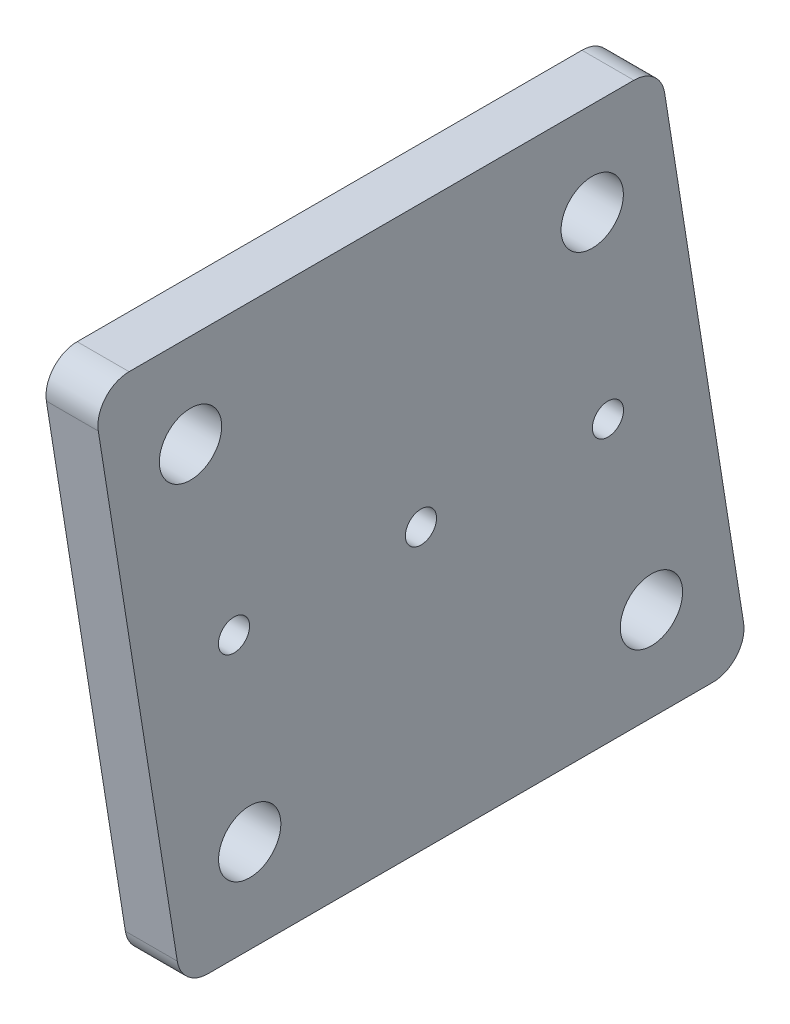
ISO-10303-21;
HEADER;
FILE_DESCRIPTION(('STEP AP214'),'2;1');
FILE_NAME('part.step','',(''),(''),'','','');
FILE_SCHEMA(('AUTOMOTIVE_DESIGN { 1 0 10303 214 1 1 1 1 }'));
ENDSEC;
DATA;
#1=APPLICATION_CONTEXT('core data for automotive mechanical design processes');
#2=APPLICATION_PROTOCOL_DEFINITION('international standard','automotive_design',2000,#1);
#3=PRODUCT_CONTEXT('',#1,'mechanical');
#4=PRODUCT('Part','Part','',(#3));
#5=PRODUCT_RELATED_PRODUCT_CATEGORY('part','',(#4));
#6=PRODUCT_DEFINITION_FORMATION('','',#4);
#7=PRODUCT_DEFINITION_CONTEXT('part definition',#1,'design');
#8=PRODUCT_DEFINITION('design','',#6,#7);
#9=PRODUCT_DEFINITION_SHAPE('','',#8);
#10=(LENGTH_UNIT() NAMED_UNIT(*) SI_UNIT(.MILLI.,.METRE.));
#11=(NAMED_UNIT(*) PLANE_ANGLE_UNIT() SI_UNIT($,.RADIAN.));
#12=(NAMED_UNIT(*) SI_UNIT($,.STERADIAN.) SOLID_ANGLE_UNIT());
#13=UNCERTAINTY_MEASURE_WITH_UNIT(LENGTH_MEASURE(1.E-05),#10,'distance_accuracy_value','');
#14=(GEOMETRIC_REPRESENTATION_CONTEXT(3) GLOBAL_UNCERTAINTY_ASSIGNED_CONTEXT((#13)) GLOBAL_UNIT_ASSIGNED_CONTEXT((#10,
#11,#12)) REPRESENTATION_CONTEXT('',''));
#15=CARTESIAN_POINT('',(0.,0.,0.));
#16=DIRECTION('',(0.,0.,1.));
#17=DIRECTION('',(1.,0.,0.));
#18=AXIS2_PLACEMENT_3D('',#15,#16,#17);
#19=CARTESIAN_POINT('',(5.,0.,0.));
#20=DIRECTION('',(1.,0.,0.));
#21=DIRECTION('',(0.,0.,-1.));
#22=AXIS2_PLACEMENT_3D('',#19,#20,#21);
#23=PLANE('',#22);
#24=CARTESIAN_POINT('',(5.,18.,1.51283602329086));
#25=DIRECTION('',(1.,0.,0.));
#26=DIRECTION('',(0.,0.,-1.));
#27=AXIS2_PLACEMENT_3D('',#24,#25,#26);
#28=CIRCLE('',#27,1.5);
#29=CARTESIAN_POINT('',(5.,18.,0.0128360232908549));
#30=VERTEX_POINT('',#29);
#31=EDGE_CURVE('E205',#30,#30,#28,.T.);
#32=ORIENTED_EDGE('',*,*,#31,.F.);
#33=EDGE_LOOP('',(#32));
#34=FACE_BOUND('',#33,.T.);
#35=CARTESIAN_POINT('',(5.,36.,-32.9743279534183));
#36=DIRECTION('',(1.,0.,0.));
#37=DIRECTION('',(0.,0.,-1.));
#38=AXIS2_PLACEMENT_3D('',#35,#36,#37);
#39=CIRCLE('',#38,2.99999999999999);
#40=CARTESIAN_POINT('',(5.,36.,-35.9743279534183));
#41=VERTEX_POINT('',#40);
#42=EDGE_CURVE('E193',#41,#41,#39,.T.);
#43=ORIENTED_EDGE('',*,*,#42,.F.);
#44=EDGE_LOOP('',(#43));
#45=FACE_BOUND('',#44,.T.);
#46=CARTESIAN_POINT('',(5.,0.,-38.6761678051017));
#47=DIRECTION('',(1.,0.,0.));
#48=DIRECTION('',(0.,0.,-1.));
#49=AXIS2_PLACEMENT_3D('',#46,#47,#48);
#50=CIRCLE('',#49,3.);
#51=CARTESIAN_POINT('',(5.,0.,-41.6761678051017));
#52=VERTEX_POINT('',#51);
#53=EDGE_CURVE('E182',#52,#52,#50,.T.);
#54=ORIENTED_EDGE('',*,*,#53,.F.);
#55=EDGE_LOOP('',(#54));
#56=FACE_BOUND('',#55,.T.);
#57=DIRECTION('',(0.,0.987688340595137,0.156434465040235));
#58=VECTOR('',#57,1.);
#59=CARTESIAN_POINT('',(5.,-8.99999999999999,-48.1001022617478));
#60=LINE('',#59,#58);
#61=CARTESIAN_POINT('',(5.,-5.53069660487929,-47.5506185851956));
#62=VERTEX_POINT('',#61);
#63=CARTESIAN_POINT('',(5.,42.4693033951207,-39.9481654496177));
#64=VERTEX_POINT('',#63);
#65=EDGE_CURVE('E177',#62,#64,#60,.T.);
#66=ORIENTED_EDGE('',*,*,#65,.T.);
#67=CARTESIAN_POINT('',(5.,42.,-36.9851004278322));
#68=DIRECTION('',(1.,0.,0.));
#69=DIRECTION('',(0.,0.,-1.));
#70=AXIS2_PLACEMENT_3D('',#67,#68,#69);
#71=CIRCLE('',#70,3.);
#72=CARTESIAN_POINT('',(5.,45.,-36.9851004278322));
#73=VERTEX_POINT('',#72);
#74=EDGE_CURVE('E154',#64,#73,#71,.T.);
#75=ORIENTED_EDGE('',*,*,#74,.T.);
#76=DIRECTION('',(0.,0.,1.));
#77=VECTOR('',#76,1.);
#78=CARTESIAN_POINT('',(5.,45.,-39.5473424842226));
#79=LINE('',#78,#77);
#80=CARTESIAN_POINT('',(5.,45.,11.6132256099919));
#81=VERTEX_POINT('',#80);
#82=EDGE_CURVE('E125',#73,#81,#79,.T.);
#83=ORIENTED_EDGE('',*,*,#82,.T.);
#84=CARTESIAN_POINT('',(5.,42.,11.6132256099919));
#85=DIRECTION('',(1.,0.,0.));
#86=DIRECTION('',(0.,0.,-1.));
#87=AXIS2_PLACEMENT_3D('',#84,#85,#86);
#88=CIRCLE('',#87,3.);
#89=CARTESIAN_POINT('',(5.,41.5306966048793,14.5762906317773));
#90=VERTEX_POINT('',#89);
#91=EDGE_CURVE('E149',#81,#90,#88,.T.);
#92=ORIENTED_EDGE('',*,*,#91,.T.);
#93=DIRECTION('',(0.,-0.987688340595137,-0.156434465040235));
#94=VECTOR('',#93,1.);
#95=CARTESIAN_POINT('',(5.,45.,15.1257743083295));
#96=LINE('',#95,#94);
#97=CARTESIAN_POINT('',(5.,-6.46930339512072,6.97383749619938));
#98=VERTEX_POINT('',#97);
#99=EDGE_CURVE('E132',#90,#98,#96,.T.);
#100=ORIENTED_EDGE('',*,*,#99,.T.);
#101=CARTESIAN_POINT('',(5.,-6.,4.01077247441397));
#102=DIRECTION('',(1.,0.,0.));
#103=DIRECTION('',(0.,0.,-1.));
#104=AXIS2_PLACEMENT_3D('',#101,#102,#103);
#105=CIRCLE('',#104,3.);
#106=CARTESIAN_POINT('',(5.,-9.,4.01077247441397));
#107=VERTEX_POINT('',#106);
#108=EDGE_CURVE('E61',#98,#107,#105,.T.);
#109=ORIENTED_EDGE('',*,*,#108,.T.);
#110=DIRECTION('',(0.,0.,-1.));
#111=VECTOR('',#110,1.);
#112=CARTESIAN_POINT('',(5.,-9.,6.57301453080436));
#113=LINE('',#112,#111);
#114=CARTESIAN_POINT('',(5.,-8.99999999999999,-44.5875535634102));
#115=VERTEX_POINT('',#114);
#116=EDGE_CURVE('E135',#107,#115,#113,.T.);
#117=ORIENTED_EDGE('',*,*,#116,.T.);
#118=CARTESIAN_POINT('',(5.,-5.99999999999999,-44.5875535634102));
#119=DIRECTION('',(1.,0.,0.));
#120=DIRECTION('',(0.,0.,-1.));
#121=AXIS2_PLACEMENT_3D('',#118,#119,#120);
#122=CIRCLE('',#121,3.);
#123=EDGE_CURVE('E152',#115,#62,#122,.T.);
#124=ORIENTED_EDGE('',*,*,#123,.T.);
#125=EDGE_LOOP('',(#66,#75,#83,#92,#100,#109,#117,#124));
#126=FACE_BOUND('',#125,.T.);
#127=CARTESIAN_POINT('',(5.,0.,0.));
#128=DIRECTION('',(1.,0.,0.));
#129=DIRECTION('',(0.,0.,-1.));
#130=AXIS2_PLACEMENT_3D('',#127,#128,#129);
#131=CIRCLE('',#130,3.);
#132=CARTESIAN_POINT('',(5.,0.,-3.));
#133=VERTEX_POINT('',#132);
#134=EDGE_CURVE('E170',#133,#133,#131,.T.);
#135=ORIENTED_EDGE('',*,*,#134,.F.);
#136=EDGE_LOOP('',(#135));
#137=FACE_BOUND('',#136,.T.);
#138=CARTESIAN_POINT('',(5.,36.,5.70183985168344));
#139=DIRECTION('',(1.,0.,0.));
#140=DIRECTION('',(0.,0.,-1.));
#141=AXIS2_PLACEMENT_3D('',#138,#139,#140);
#142=CIRCLE('',#141,3.);
#143=CARTESIAN_POINT('',(5.,36.,2.70183985168344));
#144=VERTEX_POINT('',#143);
#145=EDGE_CURVE('E187',#144,#144,#142,.T.);
#146=ORIENTED_EDGE('',*,*,#145,.F.);
#147=EDGE_LOOP('',(#146));
#148=FACE_BOUND('',#147,.T.);
#149=CARTESIAN_POINT('',(5.,18.,-16.4871639767091));
#150=DIRECTION('',(1.,0.,0.));
#151=DIRECTION('',(0.,0.,-1.));
#152=AXIS2_PLACEMENT_3D('',#149,#150,#151);
#153=CIRCLE('',#152,1.5);
#154=CARTESIAN_POINT('',(5.,18.,-17.9871639767091));
#155=VERTEX_POINT('',#154);
#156=EDGE_CURVE('E199',#155,#155,#153,.T.);
#157=ORIENTED_EDGE('',*,*,#156,.F.);
#158=EDGE_LOOP('',(#157));
#159=FACE_BOUND('',#158,.T.);
#160=CARTESIAN_POINT('',(5.,18.,-34.4871639767091));
#161=DIRECTION('',(1.,0.,0.));
#162=DIRECTION('',(0.,0.,-1.));
#163=AXIS2_PLACEMENT_3D('',#160,#161,#162);
#164=CIRCLE('',#163,1.5);
#165=CARTESIAN_POINT('',(5.,18.,-35.9871639767091));
#166=VERTEX_POINT('',#165);
#167=EDGE_CURVE('E211',#166,#166,#164,.T.);
#168=ORIENTED_EDGE('',*,*,#167,.F.);
#169=EDGE_LOOP('',(#168));
#170=FACE_BOUND('',#169,.T.);
#171=ADVANCED_FACE('F39',(#34,#45,#56,#126,#137,#148,#159,#170),#23,.T.);
#172=CARTESIAN_POINT('',(0.,0.,0.));
#173=DIRECTION('',(1.,0.,0.));
#174=DIRECTION('',(0.,0.,-1.));
#175=AXIS2_PLACEMENT_3D('',#172,#173,#174);
#176=PLANE('',#175);
#177=DIRECTION('',(0.,0.,1.));
#178=VECTOR('',#177,1.);
#179=CARTESIAN_POINT('',(0.,45.,-39.5473424842226));
#180=LINE('',#179,#178);
#181=CARTESIAN_POINT('',(0.,45.,-36.9851004278322));
#182=VERTEX_POINT('',#181);
#183=CARTESIAN_POINT('',(0.,45.,11.6132256099919));
#184=VERTEX_POINT('',#183);
#185=EDGE_CURVE('E122',#182,#184,#180,.T.);
#186=ORIENTED_EDGE('',*,*,#185,.F.);
#187=CARTESIAN_POINT('',(0.,42.,-36.9851004278322));
#188=DIRECTION('',(1.,0.,0.));
#189=DIRECTION('',(0.,0.,-1.));
#190=AXIS2_PLACEMENT_3D('',#187,#188,#189);
#191=CIRCLE('',#190,3.);
#192=CARTESIAN_POINT('',(0.,42.4693033951207,-39.9481654496177));
#193=VERTEX_POINT('',#192);
#194=EDGE_CURVE('E105',#182,#193,#191,.F.);
#195=ORIENTED_EDGE('',*,*,#194,.T.);
#196=DIRECTION('',(0.,0.987688340595137,0.156434465040235));
#197=VECTOR('',#196,1.);
#198=CARTESIAN_POINT('',(0.,-8.99999999999999,-48.1001022617478));
#199=LINE('',#198,#197);
#200=CARTESIAN_POINT('',(0.,-5.53069660487929,-47.5506185851956));
#201=VERTEX_POINT('',#200);
#202=EDGE_CURVE('E133',#201,#193,#199,.T.);
#203=ORIENTED_EDGE('',*,*,#202,.F.);
#204=CARTESIAN_POINT('',(0.,-5.99999999999999,-44.5875535634102));
#205=DIRECTION('',(1.,0.,0.));
#206=DIRECTION('',(0.,0.,-1.));
#207=AXIS2_PLACEMENT_3D('',#204,#205,#206);
#208=CIRCLE('',#207,3.);
#209=CARTESIAN_POINT('',(0.,-8.99999999999999,-44.5875535634102));
#210=VERTEX_POINT('',#209);
#211=EDGE_CURVE('E116',#201,#210,#208,.F.);
#212=ORIENTED_EDGE('',*,*,#211,.T.);
#213=DIRECTION('',(0.,0.,-1.));
#214=VECTOR('',#213,1.);
#215=CARTESIAN_POINT('',(0.,-9.,6.57301453080436));
#216=LINE('',#215,#214);
#217=CARTESIAN_POINT('',(0.,-9.,4.01077247441397));
#218=VERTEX_POINT('',#217);
#219=EDGE_CURVE('E137',#218,#210,#216,.T.);
#220=ORIENTED_EDGE('',*,*,#219,.F.);
#221=CARTESIAN_POINT('',(0.,-6.,4.01077247441397));
#222=DIRECTION('',(1.,0.,0.));
#223=DIRECTION('',(0.,0.,-1.));
#224=AXIS2_PLACEMENT_3D('',#221,#222,#223);
#225=CIRCLE('',#224,3.);
#226=CARTESIAN_POINT('',(0.,-6.46930339512072,6.97383749619938));
#227=VERTEX_POINT('',#226);
#228=EDGE_CURVE('E143',#218,#227,#225,.F.);
#229=ORIENTED_EDGE('',*,*,#228,.T.);
#230=DIRECTION('',(0.,-0.987688340595137,-0.156434465040235));
#231=VECTOR('',#230,1.);
#232=CARTESIAN_POINT('',(0.,45.,15.1257743083295));
#233=LINE('',#232,#231);
#234=CARTESIAN_POINT('',(0.,41.5306966048793,14.5762906317773));
#235=VERTEX_POINT('',#234);
#236=EDGE_CURVE('E165',#235,#227,#233,.T.);
#237=ORIENTED_EDGE('',*,*,#236,.F.);
#238=CARTESIAN_POINT('',(0.,42.,11.6132256099919));
#239=DIRECTION('',(1.,0.,0.));
#240=DIRECTION('',(0.,0.,-1.));
#241=AXIS2_PLACEMENT_3D('',#238,#239,#240);
#242=CIRCLE('',#241,3.);
#243=EDGE_CURVE('E126',#235,#184,#242,.F.);
#244=ORIENTED_EDGE('',*,*,#243,.T.);
#245=EDGE_LOOP('',(#186,#195,#203,#212,#220,#229,#237,#244));
#246=FACE_BOUND('',#245,.T.);
#247=CARTESIAN_POINT('',(0.,0.,0.));
#248=DIRECTION('',(1.,0.,0.));
#249=DIRECTION('',(0.,0.,-1.));
#250=AXIS2_PLACEMENT_3D('',#247,#248,#249);
#251=CIRCLE('',#250,3.);
#252=CARTESIAN_POINT('',(0.,0.,-3.));
#253=VERTEX_POINT('',#252);
#254=EDGE_CURVE('E173',#253,#253,#251,.T.);
#255=ORIENTED_EDGE('',*,*,#254,.T.);
#256=EDGE_LOOP('',(#255));
#257=FACE_BOUND('',#256,.T.);
#258=CARTESIAN_POINT('',(0.,0.,-38.6761678051017));
#259=DIRECTION('',(1.,0.,0.));
#260=DIRECTION('',(0.,0.,-1.));
#261=AXIS2_PLACEMENT_3D('',#258,#259,#260);
#262=CIRCLE('',#261,3.);
#263=CARTESIAN_POINT('',(0.,0.,-41.6761678051017));
#264=VERTEX_POINT('',#263);
#265=EDGE_CURVE('E184',#264,#264,#262,.T.);
#266=ORIENTED_EDGE('',*,*,#265,.T.);
#267=EDGE_LOOP('',(#266));
#268=FACE_BOUND('',#267,.T.);
#269=CARTESIAN_POINT('',(0.,36.,5.70183985168344));
#270=DIRECTION('',(1.,0.,0.));
#271=DIRECTION('',(0.,0.,-1.));
#272=AXIS2_PLACEMENT_3D('',#269,#270,#271);
#273=CIRCLE('',#272,3.);
#274=CARTESIAN_POINT('',(0.,36.,2.70183985168344));
#275=VERTEX_POINT('',#274);
#276=EDGE_CURVE('E190',#275,#275,#273,.T.);
#277=ORIENTED_EDGE('',*,*,#276,.T.);
#278=EDGE_LOOP('',(#277));
#279=FACE_BOUND('',#278,.T.);
#280=CARTESIAN_POINT('',(0.,36.,-32.9743279534183));
#281=DIRECTION('',(1.,0.,0.));
#282=DIRECTION('',(0.,0.,-1.));
#283=AXIS2_PLACEMENT_3D('',#280,#281,#282);
#284=CIRCLE('',#283,2.99999999999999);
#285=CARTESIAN_POINT('',(0.,36.,-35.9743279534183));
#286=VERTEX_POINT('',#285);
#287=EDGE_CURVE('E196',#286,#286,#284,.T.);
#288=ORIENTED_EDGE('',*,*,#287,.T.);
#289=EDGE_LOOP('',(#288));
#290=FACE_BOUND('',#289,.T.);
#291=CARTESIAN_POINT('',(0.,18.,-16.4871639767091));
#292=DIRECTION('',(1.,0.,0.));
#293=DIRECTION('',(0.,0.,-1.));
#294=AXIS2_PLACEMENT_3D('',#291,#292,#293);
#295=CIRCLE('',#294,1.5);
#296=CARTESIAN_POINT('',(0.,18.,-17.9871639767091));
#297=VERTEX_POINT('',#296);
#298=EDGE_CURVE('E202',#297,#297,#295,.T.);
#299=ORIENTED_EDGE('',*,*,#298,.T.);
#300=EDGE_LOOP('',(#299));
#301=FACE_BOUND('',#300,.T.);
#302=CARTESIAN_POINT('',(0.,18.,1.51283602329086));
#303=DIRECTION('',(1.,0.,0.));
#304=DIRECTION('',(0.,0.,-1.));
#305=AXIS2_PLACEMENT_3D('',#302,#303,#304);
#306=CIRCLE('',#305,1.5);
#307=CARTESIAN_POINT('',(0.,18.,0.0128360232908549));
#308=VERTEX_POINT('',#307);
#309=EDGE_CURVE('E208',#308,#308,#306,.T.);
#310=ORIENTED_EDGE('',*,*,#309,.T.);
#311=EDGE_LOOP('',(#310));
#312=FACE_BOUND('',#311,.T.);
#313=CARTESIAN_POINT('',(0.,18.,-34.4871639767091));
#314=DIRECTION('',(1.,0.,0.));
#315=DIRECTION('',(0.,0.,-1.));
#316=AXIS2_PLACEMENT_3D('',#313,#314,#315);
#317=CIRCLE('',#316,1.5);
#318=CARTESIAN_POINT('',(0.,18.,-35.9871639767091));
#319=VERTEX_POINT('',#318);
#320=EDGE_CURVE('E214',#319,#319,#317,.T.);
#321=ORIENTED_EDGE('',*,*,#320,.T.);
#322=EDGE_LOOP('',(#321));
#323=FACE_BOUND('',#322,.T.);
#324=ADVANCED_FACE('F129',(#246,#257,#268,#279,#290,#301,#312,#323),#176,.F.);
#325=CARTESIAN_POINT('',(5.,45.,15.1257743083295));
#326=DIRECTION('',(0.,0.156434465040235,-0.987688340595137));
#327=DIRECTION('',(0.,0.987688340595137,0.156434465040235));
#328=AXIS2_PLACEMENT_3D('',#325,#326,#327);
#329=PLANE('',#328);
#330=ORIENTED_EDGE('',*,*,#236,.T.);
#331=DIRECTION('',(-1.,0.,0.));
#332=VECTOR('',#331,1.);
#333=CARTESIAN_POINT('',(5.,-6.4693033951207,6.97383749619938));
#334=LINE('',#333,#332);
#335=EDGE_CURVE('E11',#227,#98,#334,.F.);
#336=ORIENTED_EDGE('',*,*,#335,.T.);
#337=ORIENTED_EDGE('',*,*,#99,.F.);
#338=DIRECTION('',(-1.,0.,0.));
#339=VECTOR('',#338,1.);
#340=CARTESIAN_POINT('',(5.,41.5306966048793,14.5762906317773));
#341=LINE('',#340,#339);
#342=EDGE_CURVE('E47',#90,#235,#341,.T.);
#343=ORIENTED_EDGE('',*,*,#342,.T.);
#344=EDGE_LOOP('',(#330,#336,#337,#343));
#345=FACE_BOUND('',#344,.T.);
#346=ADVANCED_FACE('F164',(#345),#329,.F.);
#347=CARTESIAN_POINT('',(5.,-9.,6.57301453080436));
#348=DIRECTION('',(0.,1.,0.));
#349=DIRECTION('',(0.,0.,1.));
#350=AXIS2_PLACEMENT_3D('',#347,#348,#349);
#351=PLANE('',#350);
#352=ORIENTED_EDGE('',*,*,#219,.T.);
#353=DIRECTION('',(-1.,0.,0.));
#354=VECTOR('',#353,1.);
#355=CARTESIAN_POINT('',(5.,-8.99999999999999,-44.5875535634102));
#356=LINE('',#355,#354);
#357=EDGE_CURVE('E54',#210,#115,#356,.F.);
#358=ORIENTED_EDGE('',*,*,#357,.T.);
#359=ORIENTED_EDGE('',*,*,#116,.F.);
#360=DIRECTION('',(-1.,0.,0.));
#361=VECTOR('',#360,1.);
#362=CARTESIAN_POINT('',(5.,-9.,4.01077247441397));
#363=LINE('',#362,#361);
#364=EDGE_CURVE('E156',#107,#218,#363,.T.);
#365=ORIENTED_EDGE('',*,*,#364,.T.);
#366=EDGE_LOOP('',(#352,#358,#359,#365));
#367=FACE_BOUND('',#366,.T.);
#368=ADVANCED_FACE('F242',(#367),#351,.F.);
#369=CARTESIAN_POINT('',(5.,-8.99999999999999,-48.1001022617478));
#370=DIRECTION('',(0.,-0.156434465040235,0.987688340595137));
#371=DIRECTION('',(0.,-0.987688340595137,-0.156434465040235));
#372=AXIS2_PLACEMENT_3D('',#369,#370,#371);
#373=PLANE('',#372);
#374=ORIENTED_EDGE('',*,*,#202,.T.);
#375=DIRECTION('',(-1.,0.,0.));
#376=VECTOR('',#375,1.);
#377=CARTESIAN_POINT('',(5.,42.4693033951207,-39.9481654496177));
#378=LINE('',#377,#376);
#379=EDGE_CURVE('E110',#193,#64,#378,.F.);
#380=ORIENTED_EDGE('',*,*,#379,.T.);
#381=ORIENTED_EDGE('',*,*,#65,.F.);
#382=DIRECTION('',(-1.,0.,0.));
#383=VECTOR('',#382,1.);
#384=CARTESIAN_POINT('',(5.,-5.53069660487929,-47.5506185851956));
#385=LINE('',#384,#383);
#386=EDGE_CURVE('E115',#62,#201,#385,.T.);
#387=ORIENTED_EDGE('',*,*,#386,.T.);
#388=EDGE_LOOP('',(#374,#380,#381,#387));
#389=FACE_BOUND('',#388,.T.);
#390=ADVANCED_FACE('F239',(#389),#373,.F.);
#391=CARTESIAN_POINT('',(5.,45.,-39.5473424842226));
#392=DIRECTION('',(0.,-1.,0.));
#393=DIRECTION('',(0.,0.,-1.));
#394=AXIS2_PLACEMENT_3D('',#391,#392,#393);
#395=PLANE('',#394);
#396=ORIENTED_EDGE('',*,*,#82,.F.);
#397=DIRECTION('',(-1.,0.,0.));
#398=VECTOR('',#397,1.);
#399=CARTESIAN_POINT('',(5.,45.,-36.9851004278322));
#400=LINE('',#399,#398);
#401=EDGE_CURVE('E109',#73,#182,#400,.T.);
#402=ORIENTED_EDGE('',*,*,#401,.T.);
#403=ORIENTED_EDGE('',*,*,#185,.T.);
#404=DIRECTION('',(-1.,0.,0.));
#405=VECTOR('',#404,1.);
#406=CARTESIAN_POINT('',(5.,45.,11.6132256099919));
#407=LINE('',#406,#405);
#408=EDGE_CURVE('E127',#184,#81,#407,.F.);
#409=ORIENTED_EDGE('',*,*,#408,.T.);
#410=EDGE_LOOP('',(#396,#402,#403,#409));
#411=FACE_BOUND('',#410,.T.);
#412=ADVANCED_FACE('F121',(#411),#395,.F.);
#413=CARTESIAN_POINT('',(5.,0.,0.));
#414=DIRECTION('',(-1.,0.,0.));
#415=DIRECTION('',(0.,0.,1.));
#416=AXIS2_PLACEMENT_3D('',#413,#414,#415);
#417=CYLINDRICAL_SURFACE('',#416,3.);
#418=ORIENTED_EDGE('',*,*,#134,.T.);
#419=EDGE_LOOP('',(#418));
#420=FACE_BOUND('',#419,.T.);
#421=ORIENTED_EDGE('',*,*,#254,.F.);
#422=EDGE_LOOP('',(#421));
#423=FACE_BOUND('',#422,.T.);
#424=ADVANCED_FACE('F234',(#420,#423),#417,.F.);
#425=CARTESIAN_POINT('',(5.,0.,-38.6761678051017));
#426=DIRECTION('',(-1.,0.,0.));
#427=DIRECTION('',(0.,0.,1.));
#428=AXIS2_PLACEMENT_3D('',#425,#426,#427);
#429=CYLINDRICAL_SURFACE('',#428,3.);
#430=ORIENTED_EDGE('',*,*,#53,.T.);
#431=EDGE_LOOP('',(#430));
#432=FACE_BOUND('',#431,.T.);
#433=ORIENTED_EDGE('',*,*,#265,.F.);
#434=EDGE_LOOP('',(#433));
#435=FACE_BOUND('',#434,.T.);
#436=ADVANCED_FACE('F294',(#432,#435),#429,.F.);
#437=CARTESIAN_POINT('',(5.,36.,5.70183985168344));
#438=DIRECTION('',(-1.,0.,0.));
#439=DIRECTION('',(0.,0.,1.));
#440=AXIS2_PLACEMENT_3D('',#437,#438,#439);
#441=CYLINDRICAL_SURFACE('',#440,3.);
#442=ORIENTED_EDGE('',*,*,#145,.T.);
#443=EDGE_LOOP('',(#442));
#444=FACE_BOUND('',#443,.T.);
#445=ORIENTED_EDGE('',*,*,#276,.F.);
#446=EDGE_LOOP('',(#445));
#447=FACE_BOUND('',#446,.T.);
#448=ADVANCED_FACE('F291',(#444,#447),#441,.F.);
#449=CARTESIAN_POINT('',(5.,36.,-32.9743279534183));
#450=DIRECTION('',(-1.,0.,0.));
#451=DIRECTION('',(0.,0.,1.));
#452=AXIS2_PLACEMENT_3D('',#449,#450,#451);
#453=CYLINDRICAL_SURFACE('',#452,2.99999999999999);
#454=ORIENTED_EDGE('',*,*,#42,.T.);
#455=EDGE_LOOP('',(#454));
#456=FACE_BOUND('',#455,.T.);
#457=ORIENTED_EDGE('',*,*,#287,.F.);
#458=EDGE_LOOP('',(#457));
#459=FACE_BOUND('',#458,.T.);
#460=ADVANCED_FACE('F274',(#456,#459),#453,.F.);
#461=CARTESIAN_POINT('',(5.,18.,-16.4871639767091));
#462=DIRECTION('',(-1.,0.,0.));
#463=DIRECTION('',(0.,0.,1.));
#464=AXIS2_PLACEMENT_3D('',#461,#462,#463);
#465=CYLINDRICAL_SURFACE('',#464,1.5);
#466=ORIENTED_EDGE('',*,*,#156,.T.);
#467=EDGE_LOOP('',(#466));
#468=FACE_BOUND('',#467,.T.);
#469=ORIENTED_EDGE('',*,*,#298,.F.);
#470=EDGE_LOOP('',(#469));
#471=FACE_BOUND('',#470,.T.);
#472=ADVANCED_FACE('F270',(#468,#471),#465,.F.);
#473=CARTESIAN_POINT('',(5.,18.,1.51283602329086));
#474=DIRECTION('',(-1.,0.,0.));
#475=DIRECTION('',(0.,0.,1.));
#476=AXIS2_PLACEMENT_3D('',#473,#474,#475);
#477=CYLINDRICAL_SURFACE('',#476,1.5);
#478=ORIENTED_EDGE('',*,*,#31,.T.);
#479=EDGE_LOOP('',(#478));
#480=FACE_BOUND('',#479,.T.);
#481=ORIENTED_EDGE('',*,*,#309,.F.);
#482=EDGE_LOOP('',(#481));
#483=FACE_BOUND('',#482,.T.);
#484=ADVANCED_FACE('F273',(#480,#483),#477,.F.);
#485=CARTESIAN_POINT('',(5.,18.,-34.4871639767091));
#486=DIRECTION('',(-1.,0.,0.));
#487=DIRECTION('',(0.,0.,1.));
#488=AXIS2_PLACEMENT_3D('',#485,#486,#487);
#489=CYLINDRICAL_SURFACE('',#488,1.5);
#490=ORIENTED_EDGE('',*,*,#167,.T.);
#491=EDGE_LOOP('',(#490));
#492=FACE_BOUND('',#491,.T.);
#493=ORIENTED_EDGE('',*,*,#320,.F.);
#494=EDGE_LOOP('',(#493));
#495=FACE_BOUND('',#494,.T.);
#496=ADVANCED_FACE('F220',(#492,#495),#489,.F.);
#497=CARTESIAN_POINT('',(5.,42.,-36.9851004278322));
#498=DIRECTION('',(-1.,0.,0.));
#499=DIRECTION('',(0.,0.,1.));
#500=AXIS2_PLACEMENT_3D('',#497,#498,#499);
#501=CYLINDRICAL_SURFACE('',#500,3.);
#502=ORIENTED_EDGE('',*,*,#74,.F.);
#503=ORIENTED_EDGE('',*,*,#379,.F.);
#504=ORIENTED_EDGE('',*,*,#194,.F.);
#505=ORIENTED_EDGE('',*,*,#401,.F.);
#506=EDGE_LOOP('',(#502,#503,#504,#505));
#507=FACE_BOUND('',#506,.T.);
#508=ADVANCED_FACE('F108',(#507),#501,.T.);
#509=CARTESIAN_POINT('',(5.,-5.99999999999999,-44.5875535634102));
#510=DIRECTION('',(-1.,0.,0.));
#511=DIRECTION('',(0.,0.,1.));
#512=AXIS2_PLACEMENT_3D('',#509,#510,#511);
#513=CYLINDRICAL_SURFACE('',#512,3.);
#514=ORIENTED_EDGE('',*,*,#123,.F.);
#515=ORIENTED_EDGE('',*,*,#357,.F.);
#516=ORIENTED_EDGE('',*,*,#211,.F.);
#517=ORIENTED_EDGE('',*,*,#386,.F.);
#518=EDGE_LOOP('',(#514,#515,#516,#517));
#519=FACE_BOUND('',#518,.T.);
#520=ADVANCED_FACE('F250',(#519),#513,.T.);
#521=CARTESIAN_POINT('',(5.,-6.,4.01077247441397));
#522=DIRECTION('',(-1.,0.,0.));
#523=DIRECTION('',(0.,0.,1.));
#524=AXIS2_PLACEMENT_3D('',#521,#522,#523);
#525=CYLINDRICAL_SURFACE('',#524,3.);
#526=ORIENTED_EDGE('',*,*,#108,.F.);
#527=ORIENTED_EDGE('',*,*,#335,.F.);
#528=ORIENTED_EDGE('',*,*,#228,.F.);
#529=ORIENTED_EDGE('',*,*,#364,.F.);
#530=EDGE_LOOP('',(#526,#527,#528,#529));
#531=FACE_BOUND('',#530,.T.);
#532=ADVANCED_FACE('F252',(#531),#525,.T.);
#533=CARTESIAN_POINT('',(5.,42.,11.6132256099919));
#534=DIRECTION('',(-1.,0.,0.));
#535=DIRECTION('',(0.,0.,1.));
#536=AXIS2_PLACEMENT_3D('',#533,#534,#535);
#537=CYLINDRICAL_SURFACE('',#536,3.);
#538=ORIENTED_EDGE('',*,*,#91,.F.);
#539=ORIENTED_EDGE('',*,*,#408,.F.);
#540=ORIENTED_EDGE('',*,*,#243,.F.);
#541=ORIENTED_EDGE('',*,*,#342,.F.);
#542=EDGE_LOOP('',(#538,#539,#540,#541));
#543=FACE_BOUND('',#542,.T.);
#544=ADVANCED_FACE('F41',(#543),#537,.T.);
#545=CLOSED_SHELL('',(#171,#324,#346,#368,#390,#412,#424,#436,#448,#460,#472,#484,#496,#508,
#520,#532,#544));
#546=MANIFOLD_SOLID_BREP('B2',#545);
#547=ADVANCED_BREP_SHAPE_REPRESENTATION('',(#18,#546),#14);
#548=SHAPE_DEFINITION_REPRESENTATION(#9,#547);
ENDSEC;
END-ISO-10303-21;
